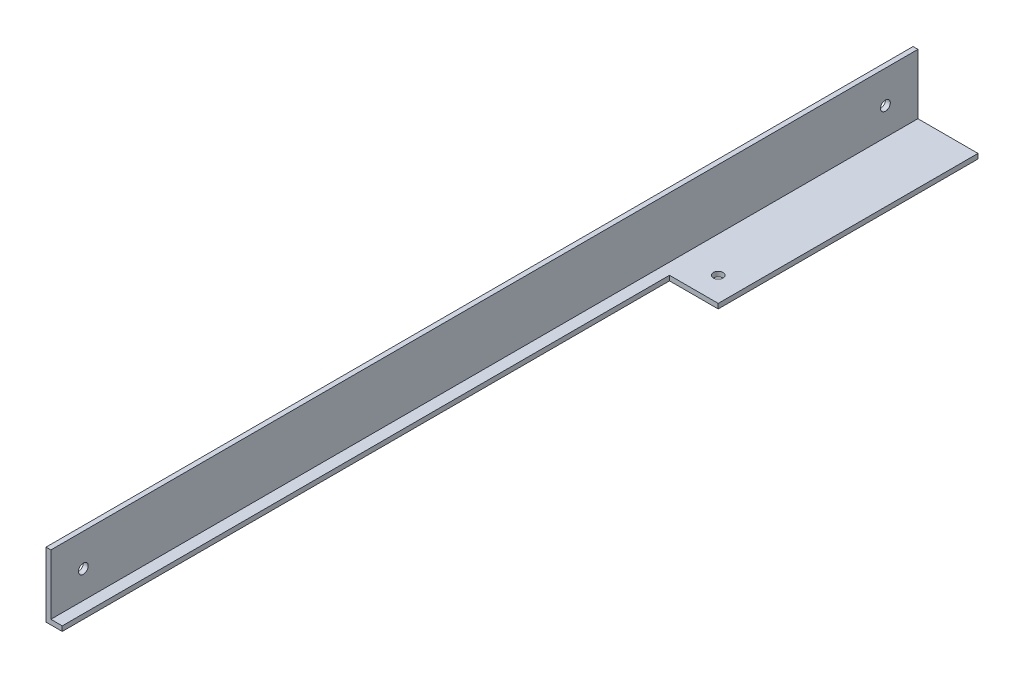
ISO-10303-21;
HEADER;
FILE_DESCRIPTION(('STEP AP214'),'2;1');
FILE_NAME('part.step','',(''),(''),'','','');
FILE_SCHEMA(('AUTOMOTIVE_DESIGN { 1 0 10303 214 1 1 1 1 }'));
ENDSEC;
DATA;
#1=APPLICATION_CONTEXT('core data for automotive mechanical design processes');
#2=APPLICATION_PROTOCOL_DEFINITION('international standard','automotive_design',2000,#1);
#3=PRODUCT_CONTEXT('',#1,'mechanical');
#4=PRODUCT('Part','Part','',(#3));
#5=PRODUCT_RELATED_PRODUCT_CATEGORY('part','',(#4));
#6=PRODUCT_DEFINITION_FORMATION('','',#4);
#7=PRODUCT_DEFINITION_CONTEXT('part definition',#1,'design');
#8=PRODUCT_DEFINITION('design','',#6,#7);
#9=PRODUCT_DEFINITION_SHAPE('','',#8);
#10=(LENGTH_UNIT() NAMED_UNIT(*) SI_UNIT(.MILLI.,.METRE.));
#11=(NAMED_UNIT(*) PLANE_ANGLE_UNIT() SI_UNIT($,.RADIAN.));
#12=(NAMED_UNIT(*) SI_UNIT($,.STERADIAN.) SOLID_ANGLE_UNIT());
#13=UNCERTAINTY_MEASURE_WITH_UNIT(LENGTH_MEASURE(1.E-05),#10,'distance_accuracy_value','');
#14=(GEOMETRIC_REPRESENTATION_CONTEXT(3) GLOBAL_UNCERTAINTY_ASSIGNED_CONTEXT((#13)) GLOBAL_UNIT_ASSIGNED_CONTEXT((#10,
#11,#12)) REPRESENTATION_CONTEXT('',''));
#15=CARTESIAN_POINT('',(0.,0.,0.));
#16=DIRECTION('',(0.,0.,1.));
#17=DIRECTION('',(1.,0.,0.));
#18=AXIS2_PLACEMENT_3D('',#15,#16,#17);
#19=CARTESIAN_POINT('',(0.,20.,267.));
#20=DIRECTION('',(1.,0.,0.));
#21=DIRECTION('',(0.,1.,0.));
#22=AXIS2_PLACEMENT_3D('',#19,#20,#21);
#23=PLANE('',#22);
#24=CARTESIAN_POINT('',(0.,10.,10.));
#25=DIRECTION('',(1.,0.,0.));
#26=DIRECTION('',(0.,1.,0.));
#27=AXIS2_PLACEMENT_3D('',#24,#25,#26);
#28=CIRCLE('',#27,1.5);
#29=CARTESIAN_POINT('',(0.,11.5,10.));
#30=VERTEX_POINT('',#29);
#31=EDGE_CURVE('E172',#30,#30,#28,.T.);
#32=ORIENTED_EDGE('',*,*,#31,.T.);
#33=EDGE_LOOP('',(#32));
#34=FACE_BOUND('',#33,.T.);
#35=CARTESIAN_POINT('',(0.,10.,257.));
#36=DIRECTION('',(1.,0.,0.));
#37=DIRECTION('',(0.,1.,0.));
#38=AXIS2_PLACEMENT_3D('',#35,#36,#37);
#39=CIRCLE('',#38,1.50000000000002);
#40=CARTESIAN_POINT('',(0.,11.5,257.));
#41=VERTEX_POINT('',#40);
#42=EDGE_CURVE('E165',#41,#41,#39,.T.);
#43=ORIENTED_EDGE('',*,*,#42,.T.);
#44=EDGE_LOOP('',(#43));
#45=FACE_BOUND('',#44,.T.);
#46=DIRECTION('',(0.,-1.,0.));
#47=VECTOR('',#46,1.);
#48=CARTESIAN_POINT('',(0.,20.,0.));
#49=LINE('',#48,#47);
#50=CARTESIAN_POINT('',(0.,20.,0.));
#51=VERTEX_POINT('',#50);
#52=CARTESIAN_POINT('',(0.,0.,0.));
#53=VERTEX_POINT('',#52);
#54=EDGE_CURVE('E143',#51,#53,#49,.T.);
#55=ORIENTED_EDGE('',*,*,#54,.T.);
#56=DIRECTION('',(0.,0.,-1.));
#57=VECTOR('',#56,1.);
#58=CARTESIAN_POINT('',(0.,0.,267.));
#59=LINE('',#58,#57);
#60=CARTESIAN_POINT('',(0.,0.,267.));
#61=VERTEX_POINT('',#60);
#62=EDGE_CURVE('E11',#61,#53,#59,.T.);
#63=ORIENTED_EDGE('',*,*,#62,.F.);
#64=DIRECTION('',(0.,-1.,0.));
#65=VECTOR('',#64,1.);
#66=CARTESIAN_POINT('',(0.,20.,267.));
#67=LINE('',#66,#65);
#68=CARTESIAN_POINT('',(0.,20.,267.));
#69=VERTEX_POINT('',#68);
#70=EDGE_CURVE('E135',#69,#61,#67,.T.);
#71=ORIENTED_EDGE('',*,*,#70,.F.);
#72=DIRECTION('',(0.,0.,-1.));
#73=VECTOR('',#72,1.);
#74=CARTESIAN_POINT('',(0.,20.,267.));
#75=LINE('',#74,#73);
#76=EDGE_CURVE('E132',#69,#51,#75,.T.);
#77=ORIENTED_EDGE('',*,*,#76,.T.);
#78=EDGE_LOOP('',(#55,#63,#71,#77));
#79=FACE_BOUND('',#78,.T.);
#80=ADVANCED_FACE('F31',(#34,#45,#79),#23,.F.);
#81=CARTESIAN_POINT('',(0.,0.,267.));
#82=DIRECTION('',(0.,1.,0.));
#83=DIRECTION('',(0.,0.,1.));
#84=AXIS2_PLACEMENT_3D('',#81,#82,#83);
#85=PLANE('',#84);
#86=CARTESIAN_POINT('',(12.5,0.,72.5));
#87=DIRECTION('',(0.,1.,0.));
#88=DIRECTION('',(-1.,0.,0.));
#89=AXIS2_PLACEMENT_3D('',#86,#87,#88);
#90=CIRCLE('',#89,1.5);
#91=CARTESIAN_POINT('',(11.,0.,72.5));
#92=VERTEX_POINT('',#91);
#93=EDGE_CURVE('E146',#92,#92,#90,.T.);
#94=ORIENTED_EDGE('',*,*,#93,.T.);
#95=EDGE_LOOP('',(#94));
#96=FACE_BOUND('',#95,.T.);
#97=DIRECTION('',(-1.,0.,0.));
#98=VECTOR('',#97,1.);
#99=CARTESIAN_POINT('',(20.,0.,80.));
#100=LINE('',#99,#98);
#101=CARTESIAN_POINT('',(20.,0.,80.));
#102=VERTEX_POINT('',#101);
#103=CARTESIAN_POINT('',(5.,0.,80.));
#104=VERTEX_POINT('',#103);
#105=EDGE_CURVE('E104',#102,#104,#100,.T.);
#106=ORIENTED_EDGE('',*,*,#105,.T.);
#107=DIRECTION('',(0.,0.,1.));
#108=VECTOR('',#107,1.);
#109=CARTESIAN_POINT('',(5.,0.,267.));
#110=LINE('',#109,#108);
#111=CARTESIAN_POINT('',(5.,0.,267.));
#112=VERTEX_POINT('',#111);
#113=EDGE_CURVE('E113',#104,#112,#110,.T.);
#114=ORIENTED_EDGE('',*,*,#113,.T.);
#115=DIRECTION('',(1.,0.,0.));
#116=VECTOR('',#115,1.);
#117=CARTESIAN_POINT('',(0.,0.,267.));
#118=LINE('',#117,#116);
#119=EDGE_CURVE('E88',#61,#112,#118,.T.);
#120=ORIENTED_EDGE('',*,*,#119,.F.);
#121=ORIENTED_EDGE('',*,*,#62,.T.);
#122=DIRECTION('',(1.,0.,0.));
#123=VECTOR('',#122,1.);
#124=CARTESIAN_POINT('',(0.,0.,0.));
#125=LINE('',#124,#123);
#126=CARTESIAN_POINT('',(20.,0.,0.));
#127=VERTEX_POINT('',#126);
#128=EDGE_CURVE('E123',#53,#127,#125,.T.);
#129=ORIENTED_EDGE('',*,*,#128,.T.);
#130=DIRECTION('',(0.,0.,-1.));
#131=VECTOR('',#130,1.);
#132=CARTESIAN_POINT('',(20.,0.,267.));
#133=LINE('',#132,#131);
#134=EDGE_CURVE('E38',#102,#127,#133,.T.);
#135=ORIENTED_EDGE('',*,*,#134,.F.);
#136=EDGE_LOOP('',(#106,#114,#120,#121,#129,#135));
#137=FACE_BOUND('',#136,.T.);
#138=ADVANCED_FACE('F122',(#96,#137),#85,.F.);
#139=CARTESIAN_POINT('',(20.,0.,267.));
#140=DIRECTION('',(-1.,0.,0.));
#141=DIRECTION('',(0.,0.,1.));
#142=AXIS2_PLACEMENT_3D('',#139,#140,#141);
#143=PLANE('',#142);
#144=DIRECTION('',(0.,0.,-1.));
#145=VECTOR('',#144,1.);
#146=CARTESIAN_POINT('',(20.,1.5,267.));
#147=LINE('',#146,#145);
#148=CARTESIAN_POINT('',(20.,1.5,80.));
#149=VERTEX_POINT('',#148);
#150=CARTESIAN_POINT('',(20.,1.5,0.));
#151=VERTEX_POINT('',#150);
#152=EDGE_CURVE('E120',#149,#151,#147,.T.);
#153=ORIENTED_EDGE('',*,*,#152,.F.);
#154=DIRECTION('',(0.,1.,0.));
#155=VECTOR('',#154,1.);
#156=CARTESIAN_POINT('',(20.,0.,80.));
#157=LINE('',#156,#155);
#158=EDGE_CURVE('E108',#102,#149,#157,.T.);
#159=ORIENTED_EDGE('',*,*,#158,.F.);
#160=ORIENTED_EDGE('',*,*,#134,.T.);
#161=DIRECTION('',(0.,1.,0.));
#162=VECTOR('',#161,1.);
#163=CARTESIAN_POINT('',(20.,0.,0.));
#164=LINE('',#163,#162);
#165=EDGE_CURVE('E140',#127,#151,#164,.T.);
#166=ORIENTED_EDGE('',*,*,#165,.T.);
#167=EDGE_LOOP('',(#153,#159,#160,#166));
#168=FACE_BOUND('',#167,.T.);
#169=ADVANCED_FACE('F117',(#168),#143,.F.);
#170=CARTESIAN_POINT('',(20.,1.5,267.));
#171=DIRECTION('',(0.,-1.,0.));
#172=DIRECTION('',(1.,0.,0.));
#173=AXIS2_PLACEMENT_3D('',#170,#171,#172);
#174=PLANE('',#173);
#175=CARTESIAN_POINT('',(12.5,1.5,72.5));
#176=DIRECTION('',(0.,1.,0.));
#177=DIRECTION('',(-1.,0.,0.));
#178=AXIS2_PLACEMENT_3D('',#175,#176,#177);
#179=CIRCLE('',#178,1.5);
#180=CARTESIAN_POINT('',(11.,1.5,72.5));
#181=VERTEX_POINT('',#180);
#182=EDGE_CURVE('E154',#181,#181,#179,.T.);
#183=ORIENTED_EDGE('',*,*,#182,.F.);
#184=EDGE_LOOP('',(#183));
#185=FACE_BOUND('',#184,.T.);
#186=DIRECTION('',(-1.,0.,0.));
#187=VECTOR('',#186,1.);
#188=CARTESIAN_POINT('',(20.,1.5,267.));
#189=LINE('',#188,#187);
#190=CARTESIAN_POINT('',(5.,1.5,267.));
#191=VERTEX_POINT('',#190);
#192=CARTESIAN_POINT('',(1.5,1.5,267.));
#193=VERTEX_POINT('',#192);
#194=EDGE_CURVE('E150',#191,#193,#189,.T.);
#195=ORIENTED_EDGE('',*,*,#194,.F.);
#196=DIRECTION('',(0.,0.,1.));
#197=VECTOR('',#196,1.);
#198=CARTESIAN_POINT('',(5.,1.5,267.));
#199=LINE('',#198,#197);
#200=CARTESIAN_POINT('',(5.,1.5,80.));
#201=VERTEX_POINT('',#200);
#202=EDGE_CURVE('E45',#201,#191,#199,.T.);
#203=ORIENTED_EDGE('',*,*,#202,.F.);
#204=DIRECTION('',(-1.,0.,0.));
#205=VECTOR('',#204,1.);
#206=CARTESIAN_POINT('',(20.,1.5,80.));
#207=LINE('',#206,#205);
#208=EDGE_CURVE('E163',#149,#201,#207,.T.);
#209=ORIENTED_EDGE('',*,*,#208,.F.);
#210=ORIENTED_EDGE('',*,*,#152,.T.);
#211=DIRECTION('',(-1.,0.,0.));
#212=VECTOR('',#211,1.);
#213=CARTESIAN_POINT('',(20.,1.5,0.));
#214=LINE('',#213,#212);
#215=CARTESIAN_POINT('',(1.5,1.5,0.));
#216=VERTEX_POINT('',#215);
#217=EDGE_CURVE('E138',#151,#216,#214,.T.);
#218=ORIENTED_EDGE('',*,*,#217,.T.);
#219=DIRECTION('',(0.,0.,-1.));
#220=VECTOR('',#219,1.);
#221=CARTESIAN_POINT('',(1.5,1.5,267.));
#222=LINE('',#221,#220);
#223=EDGE_CURVE('E125',#193,#216,#222,.T.);
#224=ORIENTED_EDGE('',*,*,#223,.F.);
#225=EDGE_LOOP('',(#195,#203,#209,#210,#218,#224));
#226=FACE_BOUND('',#225,.T.);
#227=ADVANCED_FACE('F186',(#185,#226),#174,.F.);
#228=CARTESIAN_POINT('',(1.5,1.5,267.));
#229=DIRECTION('',(-1.,0.,0.));
#230=DIRECTION('',(0.,-1.,0.));
#231=AXIS2_PLACEMENT_3D('',#228,#229,#230);
#232=PLANE('',#231);
#233=CARTESIAN_POINT('',(1.5,10.,10.));
#234=DIRECTION('',(1.,0.,0.));
#235=DIRECTION('',(0.,1.,0.));
#236=AXIS2_PLACEMENT_3D('',#233,#234,#235);
#237=CIRCLE('',#236,1.5);
#238=CARTESIAN_POINT('',(1.5,11.5,10.));
#239=VERTEX_POINT('',#238);
#240=EDGE_CURVE('E175',#239,#239,#237,.T.);
#241=ORIENTED_EDGE('',*,*,#240,.F.);
#242=EDGE_LOOP('',(#241));
#243=FACE_BOUND('',#242,.T.);
#244=CARTESIAN_POINT('',(1.5,10.,257.));
#245=DIRECTION('',(1.,0.,0.));
#246=DIRECTION('',(0.,1.,0.));
#247=AXIS2_PLACEMENT_3D('',#244,#245,#246);
#248=CIRCLE('',#247,1.50000000000002);
#249=CARTESIAN_POINT('',(1.5,11.5,257.));
#250=VERTEX_POINT('',#249);
#251=EDGE_CURVE('E169',#250,#250,#248,.T.);
#252=ORIENTED_EDGE('',*,*,#251,.F.);
#253=EDGE_LOOP('',(#252));
#254=FACE_BOUND('',#253,.T.);
#255=DIRECTION('',(0.,1.,0.));
#256=VECTOR('',#255,1.);
#257=CARTESIAN_POINT('',(1.5,1.5,0.));
#258=LINE('',#257,#256);
#259=CARTESIAN_POINT('',(1.5,20.,0.));
#260=VERTEX_POINT('',#259);
#261=EDGE_CURVE('E136',#216,#260,#258,.T.);
#262=ORIENTED_EDGE('',*,*,#261,.T.);
#263=DIRECTION('',(0.,0.,-1.));
#264=VECTOR('',#263,1.);
#265=CARTESIAN_POINT('',(1.5,20.,267.));
#266=LINE('',#265,#264);
#267=CARTESIAN_POINT('',(1.5,20.,267.));
#268=VERTEX_POINT('',#267);
#269=EDGE_CURVE('E130',#268,#260,#266,.T.);
#270=ORIENTED_EDGE('',*,*,#269,.F.);
#271=DIRECTION('',(0.,1.,0.));
#272=VECTOR('',#271,1.);
#273=CARTESIAN_POINT('',(1.5,1.5,267.));
#274=LINE('',#273,#272);
#275=EDGE_CURVE('E148',#193,#268,#274,.T.);
#276=ORIENTED_EDGE('',*,*,#275,.F.);
#277=ORIENTED_EDGE('',*,*,#223,.T.);
#278=EDGE_LOOP('',(#262,#270,#276,#277));
#279=FACE_BOUND('',#278,.T.);
#280=ADVANCED_FACE('F182',(#243,#254,#279),#232,.F.);
#281=CARTESIAN_POINT('',(1.5,20.,267.));
#282=DIRECTION('',(0.,-1.,0.));
#283=DIRECTION('',(0.,0.,-1.));
#284=AXIS2_PLACEMENT_3D('',#281,#282,#283);
#285=PLANE('',#284);
#286=DIRECTION('',(-1.,0.,0.));
#287=VECTOR('',#286,1.);
#288=CARTESIAN_POINT('',(1.5,20.,0.));
#289=LINE('',#288,#287);
#290=EDGE_CURVE('E81',#260,#51,#289,.T.);
#291=ORIENTED_EDGE('',*,*,#290,.T.);
#292=ORIENTED_EDGE('',*,*,#76,.F.);
#293=DIRECTION('',(-1.,0.,0.));
#294=VECTOR('',#293,1.);
#295=CARTESIAN_POINT('',(1.5,20.,267.));
#296=LINE('',#295,#294);
#297=EDGE_CURVE('E54',#268,#69,#296,.T.);
#298=ORIENTED_EDGE('',*,*,#297,.F.);
#299=ORIENTED_EDGE('',*,*,#269,.T.);
#300=EDGE_LOOP('',(#291,#292,#298,#299));
#301=FACE_BOUND('',#300,.T.);
#302=ADVANCED_FACE('F185',(#301),#285,.F.);
#303=CARTESIAN_POINT('',(0.,0.,267.));
#304=DIRECTION('',(0.,0.,1.));
#305=DIRECTION('',(1.,0.,0.));
#306=AXIS2_PLACEMENT_3D('',#303,#304,#305);
#307=PLANE('',#306);
#308=DIRECTION('',(0.,1.,0.));
#309=VECTOR('',#308,1.);
#310=CARTESIAN_POINT('',(5.,0.,267.));
#311=LINE('',#310,#309);
#312=EDGE_CURVE('E157',#112,#191,#311,.T.);
#313=ORIENTED_EDGE('',*,*,#312,.T.);
#314=ORIENTED_EDGE('',*,*,#194,.T.);
#315=ORIENTED_EDGE('',*,*,#275,.T.);
#316=ORIENTED_EDGE('',*,*,#297,.T.);
#317=ORIENTED_EDGE('',*,*,#70,.T.);
#318=ORIENTED_EDGE('',*,*,#119,.T.);
#319=EDGE_LOOP('',(#313,#314,#315,#316,#317,#318));
#320=FACE_BOUND('',#319,.T.);
#321=ADVANCED_FACE('F201',(#320),#307,.T.);
#322=CARTESIAN_POINT('',(0.,0.,0.));
#323=DIRECTION('',(0.,0.,1.));
#324=DIRECTION('',(1.,0.,0.));
#325=AXIS2_PLACEMENT_3D('',#322,#323,#324);
#326=PLANE('',#325);
#327=ORIENTED_EDGE('',*,*,#54,.F.);
#328=ORIENTED_EDGE('',*,*,#290,.F.);
#329=ORIENTED_EDGE('',*,*,#261,.F.);
#330=ORIENTED_EDGE('',*,*,#217,.F.);
#331=ORIENTED_EDGE('',*,*,#165,.F.);
#332=ORIENTED_EDGE('',*,*,#128,.F.);
#333=EDGE_LOOP('',(#327,#328,#329,#330,#331,#332));
#334=FACE_BOUND('',#333,.T.);
#335=ADVANCED_FACE('F197',(#334),#326,.F.);
#336=CARTESIAN_POINT('',(12.5,0.,72.5));
#337=DIRECTION('',(0.,1.,0.));
#338=DIRECTION('',(-1.,0.,0.));
#339=AXIS2_PLACEMENT_3D('',#336,#337,#338);
#340=CYLINDRICAL_SURFACE('',#339,1.5);
#341=ORIENTED_EDGE('',*,*,#93,.F.);
#342=EDGE_LOOP('',(#341));
#343=FACE_BOUND('',#342,.T.);
#344=ORIENTED_EDGE('',*,*,#182,.T.);
#345=EDGE_LOOP('',(#344));
#346=FACE_BOUND('',#345,.T.);
#347=ADVANCED_FACE('F235',(#343,#346),#340,.F.);
#348=CARTESIAN_POINT('',(5.,0.,267.));
#349=DIRECTION('',(-1.,0.,0.));
#350=DIRECTION('',(0.,-1.,0.));
#351=AXIS2_PLACEMENT_3D('',#348,#349,#350);
#352=PLANE('',#351);
#353=ORIENTED_EDGE('',*,*,#202,.T.);
#354=ORIENTED_EDGE('',*,*,#312,.F.);
#355=ORIENTED_EDGE('',*,*,#113,.F.);
#356=DIRECTION('',(0.,1.,0.));
#357=VECTOR('',#356,1.);
#358=CARTESIAN_POINT('',(5.,0.,80.));
#359=LINE('',#358,#357);
#360=EDGE_CURVE('E110',#104,#201,#359,.T.);
#361=ORIENTED_EDGE('',*,*,#360,.T.);
#362=EDGE_LOOP('',(#353,#354,#355,#361));
#363=FACE_BOUND('',#362,.T.);
#364=ADVANCED_FACE('F231',(#363),#352,.F.);
#365=CARTESIAN_POINT('',(20.,0.,80.));
#366=DIRECTION('',(0.,0.,-1.));
#367=DIRECTION('',(-1.,0.,0.));
#368=AXIS2_PLACEMENT_3D('',#365,#366,#367);
#369=PLANE('',#368);
#370=ORIENTED_EDGE('',*,*,#208,.T.);
#371=ORIENTED_EDGE('',*,*,#360,.F.);
#372=ORIENTED_EDGE('',*,*,#105,.F.);
#373=ORIENTED_EDGE('',*,*,#158,.T.);
#374=EDGE_LOOP('',(#370,#371,#372,#373));
#375=FACE_BOUND('',#374,.T.);
#376=ADVANCED_FACE('F107',(#375),#369,.F.);
#377=CARTESIAN_POINT('',(-262.5,9.99999999999998,257.));
#378=DIRECTION('',(1.,0.,0.));
#379=DIRECTION('',(0.,1.,0.));
#380=AXIS2_PLACEMENT_3D('',#377,#378,#379);
#381=CYLINDRICAL_SURFACE('',#380,1.50000000000002);
#382=ORIENTED_EDGE('',*,*,#251,.T.);
#383=EDGE_LOOP('',(#382));
#384=FACE_BOUND('',#383,.T.);
#385=ORIENTED_EDGE('',*,*,#42,.F.);
#386=EDGE_LOOP('',(#385));
#387=FACE_BOUND('',#386,.T.);
#388=ADVANCED_FACE('F222',(#384,#387),#381,.F.);
#389=CARTESIAN_POINT('',(-262.5,9.99999999999998,10.));
#390=DIRECTION('',(1.,0.,0.));
#391=DIRECTION('',(0.,1.,0.));
#392=AXIS2_PLACEMENT_3D('',#389,#390,#391);
#393=CYLINDRICAL_SURFACE('',#392,1.5);
#394=ORIENTED_EDGE('',*,*,#240,.T.);
#395=EDGE_LOOP('',(#394));
#396=FACE_BOUND('',#395,.T.);
#397=ORIENTED_EDGE('',*,*,#31,.F.);
#398=EDGE_LOOP('',(#397));
#399=FACE_BOUND('',#398,.T.);
#400=ADVANCED_FACE('F179',(#396,#399),#393,.F.);
#401=CLOSED_SHELL('',(#80,#138,#169,#227,#280,#302,#321,#335,#347,#364,#376,#388,#400));
#402=MANIFOLD_SOLID_BREP('B2',#401);
#403=ADVANCED_BREP_SHAPE_REPRESENTATION('',(#18,#402),#14);
#404=SHAPE_DEFINITION_REPRESENTATION(#9,#403);
ENDSEC;
END-ISO-10303-21;
